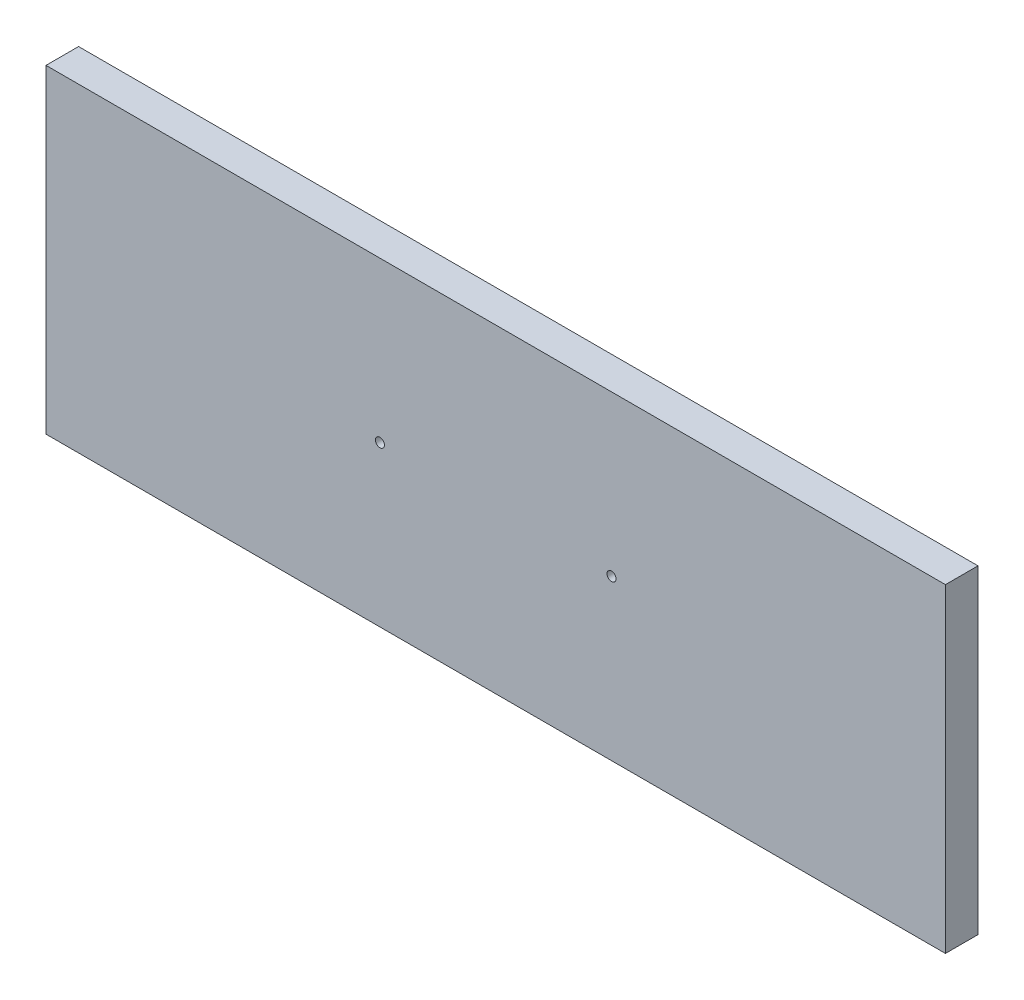
ISO-10303-21;
HEADER;
FILE_DESCRIPTION(('STEP AP214'),'2;1');
FILE_NAME('part.step','',(''),(''),'','','');
FILE_SCHEMA(('AUTOMOTIVE_DESIGN { 1 0 10303 214 1 1 1 1 }'));
ENDSEC;
DATA;
#1=APPLICATION_CONTEXT('core data for automotive mechanical design processes');
#2=APPLICATION_PROTOCOL_DEFINITION('international standard','automotive_design',2000,#1);
#3=PRODUCT_CONTEXT('',#1,'mechanical');
#4=PRODUCT('Part','Part','',(#3));
#5=PRODUCT_RELATED_PRODUCT_CATEGORY('part','',(#4));
#6=PRODUCT_DEFINITION_FORMATION('','',#4);
#7=PRODUCT_DEFINITION_CONTEXT('part definition',#1,'design');
#8=PRODUCT_DEFINITION('design','',#6,#7);
#9=PRODUCT_DEFINITION_SHAPE('','',#8);
#10=(LENGTH_UNIT() NAMED_UNIT(*) SI_UNIT(.MILLI.,.METRE.));
#11=(NAMED_UNIT(*) PLANE_ANGLE_UNIT() SI_UNIT($,.RADIAN.));
#12=(NAMED_UNIT(*) SI_UNIT($,.STERADIAN.) SOLID_ANGLE_UNIT());
#13=UNCERTAINTY_MEASURE_WITH_UNIT(LENGTH_MEASURE(1.E-05),#10,'distance_accuracy_value','');
#14=(GEOMETRIC_REPRESENTATION_CONTEXT(3) GLOBAL_UNCERTAINTY_ASSIGNED_CONTEXT((#13)) GLOBAL_UNIT_ASSIGNED_CONTEXT((#10,
#11,#12)) REPRESENTATION_CONTEXT('',''));
#15=CARTESIAN_POINT('',(0.,0.,0.));
#16=DIRECTION('',(0.,0.,1.));
#17=DIRECTION('',(1.,0.,0.));
#18=AXIS2_PLACEMENT_3D('',#15,#16,#17);
#19=CARTESIAN_POINT('',(0.,0.,18.));
#20=DIRECTION('',(0.,0.,1.));
#21=DIRECTION('',(1.,0.,0.));
#22=AXIS2_PLACEMENT_3D('',#19,#20,#21);
#23=PLANE('',#22);
#24=DIRECTION('',(-1.,0.,0.));
#25=VECTOR('',#24,1.);
#26=CARTESIAN_POINT('',(248.5,-573.5,18.));
#27=LINE('',#26,#25);
#28=CARTESIAN_POINT('',(248.5,-573.5,18.));
#29=VERTEX_POINT('',#28);
#30=CARTESIAN_POINT('',(-248.5,-573.5,18.));
#31=VERTEX_POINT('',#30);
#32=EDGE_CURVE('E85',#29,#31,#27,.T.);
#33=ORIENTED_EDGE('',*,*,#32,.T.);
#34=DIRECTION('',(0.,-1.,0.));
#35=VECTOR('',#34,1.);
#36=CARTESIAN_POINT('',(-248.5,-573.5,18.));
#37=LINE('',#36,#35);
#38=CARTESIAN_POINT('',(-248.5,-750.,18.));
#39=VERTEX_POINT('',#38);
#40=EDGE_CURVE('E80',#31,#39,#37,.T.);
#41=ORIENTED_EDGE('',*,*,#40,.T.);
#42=DIRECTION('',(1.,0.,0.));
#43=VECTOR('',#42,1.);
#44=CARTESIAN_POINT('',(248.5,-750.,18.));
#45=LINE('',#44,#43);
#46=CARTESIAN_POINT('',(248.5,-750.,18.));
#47=VERTEX_POINT('',#46);
#48=EDGE_CURVE('E83',#39,#47,#45,.T.);
#49=ORIENTED_EDGE('',*,*,#48,.T.);
#50=DIRECTION('',(0.,1.,0.));
#51=VECTOR('',#50,1.);
#52=CARTESIAN_POINT('',(248.5,-573.5,18.));
#53=LINE('',#52,#51);
#54=EDGE_CURVE('E50',#47,#29,#53,.T.);
#55=ORIENTED_EDGE('',*,*,#54,.T.);
#56=EDGE_LOOP('',(#33,#41,#49,#55));
#57=FACE_BOUND('',#56,.T.);
#58=CARTESIAN_POINT('',(-63.9999999999999,-661.75,18.));
#59=DIRECTION('',(0.,0.,1.));
#60=DIRECTION('',(1.,0.,0.));
#61=AXIS2_PLACEMENT_3D('',#58,#59,#60);
#62=CIRCLE('',#61,2.50000000000001);
#63=CARTESIAN_POINT('',(-66.4999999999999,-661.75,18.));
#64=VERTEX_POINT('',#63);
#65=EDGE_CURVE('E100',#64,#64,#62,.T.);
#66=ORIENTED_EDGE('',*,*,#65,.F.);
#67=EDGE_LOOP('',(#66));
#68=FACE_BOUND('',#67,.T.);
#69=CARTESIAN_POINT('',(64.0000000000001,-661.75,18.));
#70=DIRECTION('',(0.,0.,1.));
#71=DIRECTION('',(1.,0.,0.));
#72=AXIS2_PLACEMENT_3D('',#69,#70,#71);
#73=CIRCLE('',#72,2.5);
#74=CARTESIAN_POINT('',(61.5000000000001,-661.75,18.));
#75=VERTEX_POINT('',#74);
#76=EDGE_CURVE('E117',#75,#75,#73,.F.);
#77=ORIENTED_EDGE('',*,*,#76,.T.);
#78=EDGE_LOOP('',(#77));
#79=FACE_BOUND('',#78,.T.);
#80=ADVANCED_FACE('F33',(#57,#68,#79),#23,.T.);
#81=CARTESIAN_POINT('',(0.,0.,0.));
#82=DIRECTION('',(0.,0.,1.));
#83=DIRECTION('',(1.,0.,0.));
#84=AXIS2_PLACEMENT_3D('',#81,#82,#83);
#85=PLANE('',#84);
#86=DIRECTION('',(-1.,0.,0.));
#87=VECTOR('',#86,1.);
#88=CARTESIAN_POINT('',(248.5,-573.5,0.));
#89=LINE('',#88,#87);
#90=CARTESIAN_POINT('',(248.5,-573.5,0.));
#91=VERTEX_POINT('',#90);
#92=CARTESIAN_POINT('',(-248.5,-573.5,0.));
#93=VERTEX_POINT('',#92);
#94=EDGE_CURVE('E97',#91,#93,#89,.T.);
#95=ORIENTED_EDGE('',*,*,#94,.F.);
#96=DIRECTION('',(0.,1.,0.));
#97=VECTOR('',#96,1.);
#98=CARTESIAN_POINT('',(248.5,-573.5,0.));
#99=LINE('',#98,#97);
#100=CARTESIAN_POINT('',(248.5,-750.,0.));
#101=VERTEX_POINT('',#100);
#102=EDGE_CURVE('E73',#101,#91,#99,.T.);
#103=ORIENTED_EDGE('',*,*,#102,.F.);
#104=DIRECTION('',(1.,0.,0.));
#105=VECTOR('',#104,1.);
#106=CARTESIAN_POINT('',(248.5,-750.,0.));
#107=LINE('',#106,#105);
#108=CARTESIAN_POINT('',(-248.5,-750.,0.));
#109=VERTEX_POINT('',#108);
#110=EDGE_CURVE('E67',#109,#101,#107,.T.);
#111=ORIENTED_EDGE('',*,*,#110,.F.);
#112=DIRECTION('',(0.,-1.,0.));
#113=VECTOR('',#112,1.);
#114=CARTESIAN_POINT('',(-248.5,-573.5,0.));
#115=LINE('',#114,#113);
#116=EDGE_CURVE('E89',#93,#109,#115,.T.);
#117=ORIENTED_EDGE('',*,*,#116,.F.);
#118=EDGE_LOOP('',(#95,#103,#111,#117));
#119=FACE_BOUND('',#118,.T.);
#120=CARTESIAN_POINT('',(-63.9999999999999,-661.75,0.));
#121=DIRECTION('',(0.,0.,-1.));
#122=DIRECTION('',(-1.,0.,0.));
#123=AXIS2_PLACEMENT_3D('',#120,#121,#122);
#124=CIRCLE('',#123,2.50000000000001);
#125=CARTESIAN_POINT('',(-66.4999999999999,-661.75,0.));
#126=VERTEX_POINT('',#125);
#127=EDGE_CURVE('E114',#126,#126,#124,.T.);
#128=ORIENTED_EDGE('',*,*,#127,.F.);
#129=EDGE_LOOP('',(#128));
#130=FACE_BOUND('',#129,.T.);
#131=CARTESIAN_POINT('',(64.0000000000001,-661.75,0.));
#132=DIRECTION('',(0.,0.,1.));
#133=DIRECTION('',(1.,0.,0.));
#134=AXIS2_PLACEMENT_3D('',#131,#132,#133);
#135=CIRCLE('',#134,2.5);
#136=CARTESIAN_POINT('',(61.5000000000001,-661.75,0.));
#137=VERTEX_POINT('',#136);
#138=EDGE_CURVE('E120',#137,#137,#135,.T.);
#139=ORIENTED_EDGE('',*,*,#138,.T.);
#140=EDGE_LOOP('',(#139));
#141=FACE_BOUND('',#140,.T.);
#142=ADVANCED_FACE('F108',(#119,#130,#141),#85,.F.);
#143=CARTESIAN_POINT('',(248.5,-573.5,18.));
#144=DIRECTION('',(0.,-1.,0.));
#145=DIRECTION('',(1.,0.,0.));
#146=AXIS2_PLACEMENT_3D('',#143,#144,#145);
#147=PLANE('',#146);
#148=ORIENTED_EDGE('',*,*,#94,.T.);
#149=DIRECTION('',(0.,0.,-1.));
#150=VECTOR('',#149,1.);
#151=CARTESIAN_POINT('',(-248.5,-573.5,18.));
#152=LINE('',#151,#150);
#153=EDGE_CURVE('E11',#31,#93,#152,.T.);
#154=ORIENTED_EDGE('',*,*,#153,.F.);
#155=ORIENTED_EDGE('',*,*,#32,.F.);
#156=DIRECTION('',(0.,0.,-1.));
#157=VECTOR('',#156,1.);
#158=CARTESIAN_POINT('',(248.5,-573.5,18.));
#159=LINE('',#158,#157);
#160=EDGE_CURVE('E93',#29,#91,#159,.T.);
#161=ORIENTED_EDGE('',*,*,#160,.T.);
#162=EDGE_LOOP('',(#148,#154,#155,#161));
#163=FACE_BOUND('',#162,.T.);
#164=ADVANCED_FACE('F35',(#163),#147,.F.);
#165=CARTESIAN_POINT('',(-248.5,-573.5,18.));
#166=DIRECTION('',(1.,0.,0.));
#167=DIRECTION('',(0.,1.,0.));
#168=AXIS2_PLACEMENT_3D('',#165,#166,#167);
#169=PLANE('',#168);
#170=ORIENTED_EDGE('',*,*,#116,.T.);
#171=DIRECTION('',(0.,0.,-1.));
#172=VECTOR('',#171,1.);
#173=CARTESIAN_POINT('',(-248.5,-750.,18.));
#174=LINE('',#173,#172);
#175=EDGE_CURVE('E42',#39,#109,#174,.T.);
#176=ORIENTED_EDGE('',*,*,#175,.F.);
#177=ORIENTED_EDGE('',*,*,#40,.F.);
#178=ORIENTED_EDGE('',*,*,#153,.T.);
#179=EDGE_LOOP('',(#170,#176,#177,#178));
#180=FACE_BOUND('',#179,.T.);
#181=ADVANCED_FACE('F88',(#180),#169,.F.);
#182=CARTESIAN_POINT('',(248.5,-750.,18.));
#183=DIRECTION('',(0.,1.,0.));
#184=DIRECTION('',(-1.,0.,0.));
#185=AXIS2_PLACEMENT_3D('',#182,#183,#184);
#186=PLANE('',#185);
#187=ORIENTED_EDGE('',*,*,#110,.T.);
#188=DIRECTION('',(0.,0.,-1.));
#189=VECTOR('',#188,1.);
#190=CARTESIAN_POINT('',(248.5,-750.,18.));
#191=LINE('',#190,#189);
#192=EDGE_CURVE('E90',#47,#101,#191,.T.);
#193=ORIENTED_EDGE('',*,*,#192,.F.);
#194=ORIENTED_EDGE('',*,*,#48,.F.);
#195=ORIENTED_EDGE('',*,*,#175,.T.);
#196=EDGE_LOOP('',(#187,#193,#194,#195));
#197=FACE_BOUND('',#196,.T.);
#198=ADVANCED_FACE('F91',(#197),#186,.F.);
#199=CARTESIAN_POINT('',(248.5,-573.5,18.));
#200=DIRECTION('',(-1.,0.,0.));
#201=DIRECTION('',(0.,-1.,0.));
#202=AXIS2_PLACEMENT_3D('',#199,#200,#201);
#203=PLANE('',#202);
#204=ORIENTED_EDGE('',*,*,#102,.T.);
#205=ORIENTED_EDGE('',*,*,#160,.F.);
#206=ORIENTED_EDGE('',*,*,#54,.F.);
#207=ORIENTED_EDGE('',*,*,#192,.T.);
#208=EDGE_LOOP('',(#204,#205,#206,#207));
#209=FACE_BOUND('',#208,.T.);
#210=ADVANCED_FACE('F105',(#209),#203,.F.);
#211=CARTESIAN_POINT('',(-63.9999999999999,-661.75,61.));
#212=DIRECTION('',(0.,0.,-1.));
#213=DIRECTION('',(-1.,0.,0.));
#214=AXIS2_PLACEMENT_3D('',#211,#212,#213);
#215=CYLINDRICAL_SURFACE('',#214,2.50000000000001);
#216=CARTESIAN_POINT('',(-66.4999999999999,-661.75,18.));
#217=CARTESIAN_POINT('',(-66.4999999999999,-661.75,17.8125));
#218=CARTESIAN_POINT('',(-66.4999999999999,-661.75,17.625));
#219=CARTESIAN_POINT('',(-66.4999999999999,-661.75,17.25));
#220=CARTESIAN_POINT('',(-66.4999999999999,-661.75,17.0625));
#221=CARTESIAN_POINT('',(-66.4999999999999,-661.75,16.6875));
#222=CARTESIAN_POINT('',(-66.4999999999999,-661.75,16.5));
#223=CARTESIAN_POINT('',(-66.4999999999999,-661.75,16.125));
#224=CARTESIAN_POINT('',(-66.4999999999999,-661.75,15.9375));
#225=CARTESIAN_POINT('',(-66.4999999999999,-661.75,15.5625));
#226=CARTESIAN_POINT('',(-66.4999999999999,-661.75,15.375));
#227=CARTESIAN_POINT('',(-66.4999999999999,-661.75,15.));
#228=CARTESIAN_POINT('',(-66.4999999999999,-661.75,14.8125));
#229=CARTESIAN_POINT('',(-66.4999999999999,-661.75,14.4375));
#230=CARTESIAN_POINT('',(-66.4999999999999,-661.75,14.25));
#231=CARTESIAN_POINT('',(-66.4999999999999,-661.75,13.875));
#232=CARTESIAN_POINT('',(-66.4999999999999,-661.75,13.6875));
#233=CARTESIAN_POINT('',(-66.4999999999999,-661.75,13.3125));
#234=CARTESIAN_POINT('',(-66.4999999999999,-661.75,13.125));
#235=CARTESIAN_POINT('',(-66.4999999999999,-661.75,12.75));
#236=CARTESIAN_POINT('',(-66.4999999999999,-661.75,12.5625));
#237=CARTESIAN_POINT('',(-66.4999999999999,-661.75,12.1875));
#238=CARTESIAN_POINT('',(-66.4999999999999,-661.75,12.));
#239=CARTESIAN_POINT('',(-66.4999999999999,-661.75,11.625));
#240=CARTESIAN_POINT('',(-66.4999999999999,-661.75,11.4375));
#241=CARTESIAN_POINT('',(-66.4999999999999,-661.75,11.0625));
#242=CARTESIAN_POINT('',(-66.4999999999999,-661.75,10.875));
#243=CARTESIAN_POINT('',(-66.4999999999999,-661.75,10.5));
#244=CARTESIAN_POINT('',(-66.4999999999999,-661.75,10.3125));
#245=CARTESIAN_POINT('',(-66.4999999999999,-661.75,9.9375));
#246=CARTESIAN_POINT('',(-66.4999999999999,-661.75,9.75));
#247=CARTESIAN_POINT('',(-66.4999999999999,-661.75,9.375));
#248=CARTESIAN_POINT('',(-66.4999999999999,-661.75,9.1875));
#249=CARTESIAN_POINT('',(-66.4999999999999,-661.75,8.8125));
#250=CARTESIAN_POINT('',(-66.4999999999999,-661.75,8.625));
#251=CARTESIAN_POINT('',(-66.4999999999999,-661.75,8.25));
#252=CARTESIAN_POINT('',(-66.4999999999999,-661.75,8.0625));
#253=CARTESIAN_POINT('',(-66.4999999999999,-661.75,7.6875));
#254=CARTESIAN_POINT('',(-66.4999999999999,-661.75,7.5));
#255=CARTESIAN_POINT('',(-66.4999999999999,-661.75,7.125));
#256=CARTESIAN_POINT('',(-66.4999999999999,-661.75,6.9375));
#257=CARTESIAN_POINT('',(-66.4999999999999,-661.75,6.5625));
#258=CARTESIAN_POINT('',(-66.4999999999999,-661.75,6.375));
#259=CARTESIAN_POINT('',(-66.4999999999999,-661.75,6.00000000000001));
#260=CARTESIAN_POINT('',(-66.4999999999999,-661.75,5.81250000000001));
#261=CARTESIAN_POINT('',(-66.4999999999999,-661.75,5.4375));
#262=CARTESIAN_POINT('',(-66.4999999999999,-661.75,5.25));
#263=CARTESIAN_POINT('',(-66.4999999999999,-661.75,4.875));
#264=CARTESIAN_POINT('',(-66.4999999999999,-661.75,4.6875));
#265=CARTESIAN_POINT('',(-66.4999999999999,-661.75,4.3125));
#266=CARTESIAN_POINT('',(-66.4999999999999,-661.75,4.125));
#267=CARTESIAN_POINT('',(-66.4999999999999,-661.75,3.75));
#268=CARTESIAN_POINT('',(-66.4999999999999,-661.75,3.5625));
#269=CARTESIAN_POINT('',(-66.4999999999999,-661.75,3.1875));
#270=CARTESIAN_POINT('',(-66.4999999999999,-661.75,3.));
#271=CARTESIAN_POINT('',(-66.4999999999999,-661.75,2.625));
#272=CARTESIAN_POINT('',(-66.4999999999999,-661.75,2.43750000000001));
#273=CARTESIAN_POINT('',(-66.4999999999999,-661.75,2.06250000000001));
#274=CARTESIAN_POINT('',(-66.4999999999999,-661.75,1.875));
#275=CARTESIAN_POINT('',(-66.4999999999999,-661.75,1.5));
#276=CARTESIAN_POINT('',(-66.4999999999999,-661.75,1.31250000000001));
#277=CARTESIAN_POINT('',(-66.4999999999999,-661.75,0.937500000000008));
#278=CARTESIAN_POINT('',(-66.4999999999999,-661.75,0.750000000000008));
#279=CARTESIAN_POINT('',(-66.4999999999999,-661.75,0.375000000000007));
#280=CARTESIAN_POINT('',(-66.4999999999999,-661.75,0.187500000000007));
#281=CARTESIAN_POINT('',(-66.4999999999999,-661.75,0.));
#282=B_SPLINE_CURVE_WITH_KNOTS('',3,(#216,#217,#218,#219,#220,#221,#222,#223,#224,#225,#226,
#227,#228,#229,#230,#231,#232,#233,#234,#235,#236,#237,#238,#239,#240,#241,#242,#243,#244,#245,
#246,#247,#248,#249,#250,#251,#252,#253,#254,#255,#256,#257,#258,#259,#260,#261,#262,#263,#264,
#265,#266,#267,#268,#269,#270,#271,#272,#273,#274,#275,#276,#277,#278,#279,#280,#281),
.UNSPECIFIED.,.F.,.F.,(4,2,2,2,2,2,2,2,2,2,2,2,2,2,2,2,2,2,2,2,2,2,2,2,2,2,2,2,2,2,2,2,4),(0.,
0.5625,1.125,1.6875,2.25,2.8125,3.375,3.9375,4.5,5.0625,5.625,6.1875,6.74999999999999,
7.31249999999999,7.87499999999999,8.43749999999999,8.99999999999999,9.56249999999999,10.125,
10.6875,11.25,11.8125,12.375,12.9375,13.5,14.0625,14.625,15.1875,15.75,16.3125,16.875,17.4375,
18.),.UNSPECIFIED.);
#283=EDGE_CURVE('BSEAM127',#64,#126,#282,.T.);
#284=ORIENTED_EDGE('',*,*,#65,.T.);
#285=ORIENTED_EDGE('',*,*,#127,.T.);
#286=ORIENTED_EDGE('',*,*,#283,.T.);
#287=ORIENTED_EDGE('',*,*,#283,.F.);
#288=EDGE_LOOP('',(#284,#286,#285,#287));
#289=FACE_BOUND('',#288,.T.);
#290=ADVANCED_FACE('F127',(#289),#215,.F.);
#291=CARTESIAN_POINT('',(64.0000000000001,-661.75,61.));
#292=DIRECTION('',(0.,0.,-1.));
#293=DIRECTION('',(-1.,0.,0.));
#294=AXIS2_PLACEMENT_3D('',#291,#292,#293);
#295=CYLINDRICAL_SURFACE('',#294,2.5);
#296=CARTESIAN_POINT('',(61.5000000000001,-661.75,18.));
#297=CARTESIAN_POINT('',(61.5000000000001,-661.75,17.8125));
#298=CARTESIAN_POINT('',(61.5000000000001,-661.75,17.625));
#299=CARTESIAN_POINT('',(61.5000000000001,-661.75,17.25));
#300=CARTESIAN_POINT('',(61.5000000000001,-661.75,17.0625));
#301=CARTESIAN_POINT('',(61.5000000000001,-661.75,16.6875));
#302=CARTESIAN_POINT('',(61.5000000000001,-661.75,16.5));
#303=CARTESIAN_POINT('',(61.5000000000001,-661.75,16.125));
#304=CARTESIAN_POINT('',(61.5000000000001,-661.75,15.9375));
#305=CARTESIAN_POINT('',(61.5000000000001,-661.75,15.5625));
#306=CARTESIAN_POINT('',(61.5000000000001,-661.75,15.375));
#307=CARTESIAN_POINT('',(61.5000000000001,-661.75,15.));
#308=CARTESIAN_POINT('',(61.5000000000001,-661.75,14.8125));
#309=CARTESIAN_POINT('',(61.5000000000001,-661.75,14.4375));
#310=CARTESIAN_POINT('',(61.5000000000001,-661.75,14.25));
#311=CARTESIAN_POINT('',(61.5000000000001,-661.75,13.875));
#312=CARTESIAN_POINT('',(61.5000000000001,-661.75,13.6875));
#313=CARTESIAN_POINT('',(61.5000000000001,-661.75,13.3125));
#314=CARTESIAN_POINT('',(61.5000000000001,-661.75,13.125));
#315=CARTESIAN_POINT('',(61.5000000000001,-661.75,12.75));
#316=CARTESIAN_POINT('',(61.5000000000001,-661.75,12.5625));
#317=CARTESIAN_POINT('',(61.5000000000001,-661.75,12.1875));
#318=CARTESIAN_POINT('',(61.5000000000001,-661.75,12.));
#319=CARTESIAN_POINT('',(61.5000000000001,-661.75,11.625));
#320=CARTESIAN_POINT('',(61.5000000000001,-661.75,11.4375));
#321=CARTESIAN_POINT('',(61.5000000000001,-661.75,11.0625));
#322=CARTESIAN_POINT('',(61.5000000000001,-661.75,10.875));
#323=CARTESIAN_POINT('',(61.5000000000001,-661.75,10.5));
#324=CARTESIAN_POINT('',(61.5000000000001,-661.75,10.3125));
#325=CARTESIAN_POINT('',(61.5000000000001,-661.75,9.93749999999999));
#326=CARTESIAN_POINT('',(61.5000000000001,-661.75,9.74999999999999));
#327=CARTESIAN_POINT('',(61.5000000000001,-661.75,9.37499999999999));
#328=CARTESIAN_POINT('',(61.5000000000001,-661.75,9.18749999999999));
#329=CARTESIAN_POINT('',(61.5000000000001,-661.75,8.81249999999999));
#330=CARTESIAN_POINT('',(61.5000000000001,-661.75,8.62499999999999));
#331=CARTESIAN_POINT('',(61.5000000000001,-661.75,8.24999999999999));
#332=CARTESIAN_POINT('',(61.5000000000001,-661.75,8.06249999999999));
#333=CARTESIAN_POINT('',(61.5000000000001,-661.75,7.68749999999999));
#334=CARTESIAN_POINT('',(61.5000000000001,-661.75,7.49999999999999));
#335=CARTESIAN_POINT('',(61.5000000000001,-661.75,7.12499999999999));
#336=CARTESIAN_POINT('',(61.5000000000001,-661.75,6.93749999999999));
#337=CARTESIAN_POINT('',(61.5000000000001,-661.75,6.56249999999999));
#338=CARTESIAN_POINT('',(61.5000000000001,-661.75,6.37499999999999));
#339=CARTESIAN_POINT('',(61.5000000000001,-661.75,5.99999999999999));
#340=CARTESIAN_POINT('',(61.5000000000001,-661.75,5.8125));
#341=CARTESIAN_POINT('',(61.5000000000001,-661.75,5.4375));
#342=CARTESIAN_POINT('',(61.5000000000001,-661.75,5.24999999999999));
#343=CARTESIAN_POINT('',(61.5000000000001,-661.75,4.87499999999999));
#344=CARTESIAN_POINT('',(61.5000000000001,-661.75,4.68749999999999));
#345=CARTESIAN_POINT('',(61.5000000000001,-661.75,4.31249999999999));
#346=CARTESIAN_POINT('',(61.5000000000001,-661.75,4.12499999999999));
#347=CARTESIAN_POINT('',(61.5000000000001,-661.75,3.74999999999999));
#348=CARTESIAN_POINT('',(61.5000000000001,-661.75,3.56249999999999));
#349=CARTESIAN_POINT('',(61.5000000000001,-661.75,3.1875));
#350=CARTESIAN_POINT('',(61.5000000000001,-661.75,3.));
#351=CARTESIAN_POINT('',(61.5000000000001,-661.75,2.625));
#352=CARTESIAN_POINT('',(61.5000000000001,-661.75,2.4375));
#353=CARTESIAN_POINT('',(61.5000000000001,-661.75,2.06249999999999));
#354=CARTESIAN_POINT('',(61.5000000000001,-661.75,1.87499999999999));
#355=CARTESIAN_POINT('',(61.5000000000001,-661.75,1.49999999999999));
#356=CARTESIAN_POINT('',(61.5000000000001,-661.75,1.31249999999999));
#357=CARTESIAN_POINT('',(61.5000000000001,-661.75,0.937499999999994));
#358=CARTESIAN_POINT('',(61.5000000000001,-661.75,0.749999999999994));
#359=CARTESIAN_POINT('',(61.5000000000001,-661.75,0.374999999999993));
#360=CARTESIAN_POINT('',(61.5000000000001,-661.75,0.187499999999993));
#361=CARTESIAN_POINT('',(61.5000000000001,-661.75,0.));
#362=B_SPLINE_CURVE_WITH_KNOTS('',3,(#296,#297,#298,#299,#300,#301,#302,#303,#304,#305,#306,
#307,#308,#309,#310,#311,#312,#313,#314,#315,#316,#317,#318,#319,#320,#321,#322,#323,#324,#325,
#326,#327,#328,#329,#330,#331,#332,#333,#334,#335,#336,#337,#338,#339,#340,#341,#342,#343,#344,
#345,#346,#347,#348,#349,#350,#351,#352,#353,#354,#355,#356,#357,#358,#359,#360,#361),
.UNSPECIFIED.,.F.,.F.,(4,2,2,2,2,2,2,2,2,2,2,2,2,2,2,2,2,2,2,2,2,2,2,2,2,2,2,2,2,2,2,2,4),(0.,
0.5625,1.125,1.6875,2.25,2.8125,3.375,3.9375,4.5,5.0625,5.625,6.1875,6.75,7.3125,7.875,8.4375,
9.,9.5625,10.125,10.6875,11.25,11.8125,12.375,12.9375,13.5,14.0625,14.625,15.1875,15.75,16.3125,
16.875,17.4375,18.),.UNSPECIFIED.);
#363=EDGE_CURVE('BSEAM125',#75,#137,#362,.T.);
#364=ORIENTED_EDGE('',*,*,#76,.F.);
#365=ORIENTED_EDGE('',*,*,#138,.F.);
#366=ORIENTED_EDGE('',*,*,#363,.T.);
#367=ORIENTED_EDGE('',*,*,#363,.F.);
#368=EDGE_LOOP('',(#364,#366,#365,#367));
#369=FACE_BOUND('',#368,.T.);
#370=ADVANCED_FACE('F125',(#369),#295,.F.);
#371=CLOSED_SHELL('',(#80,#142,#164,#181,#198,#210,#290,#370));
#372=MANIFOLD_SOLID_BREP('B2',#371);
#373=ADVANCED_BREP_SHAPE_REPRESENTATION('',(#18,#372),#14);
#374=SHAPE_DEFINITION_REPRESENTATION(#9,#373);
ENDSEC;
END-ISO-10303-21;
